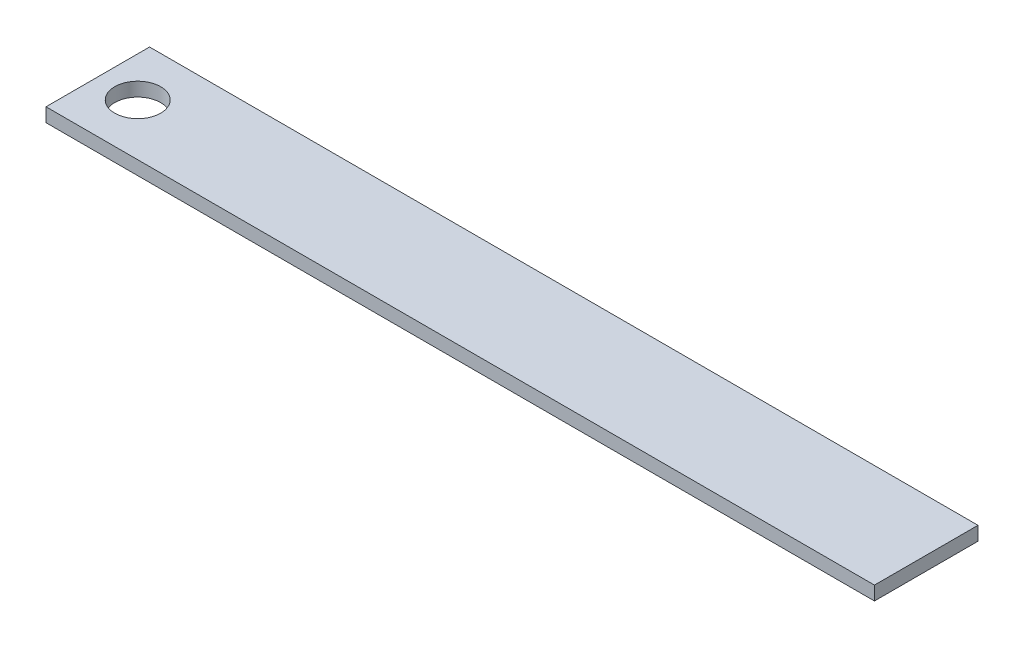
ISO-10303-21;
HEADER;
FILE_DESCRIPTION(('STEP AP214'),'2;1');
FILE_NAME('part.step','',(''),(''),'','','');
FILE_SCHEMA(('AUTOMOTIVE_DESIGN { 1 0 10303 214 1 1 1 1 }'));
ENDSEC;
DATA;
#1=APPLICATION_CONTEXT('core data for automotive mechanical design processes');
#2=APPLICATION_PROTOCOL_DEFINITION('international standard','automotive_design',2000,#1);
#3=PRODUCT_CONTEXT('',#1,'mechanical');
#4=PRODUCT('Part','Part','',(#3));
#5=PRODUCT_RELATED_PRODUCT_CATEGORY('part','',(#4));
#6=PRODUCT_DEFINITION_FORMATION('','',#4);
#7=PRODUCT_DEFINITION_CONTEXT('part definition',#1,'design');
#8=PRODUCT_DEFINITION('design','',#6,#7);
#9=PRODUCT_DEFINITION_SHAPE('','',#8);
#10=(LENGTH_UNIT() NAMED_UNIT(*) SI_UNIT(.MILLI.,.METRE.));
#11=(NAMED_UNIT(*) PLANE_ANGLE_UNIT() SI_UNIT($,.RADIAN.));
#12=(NAMED_UNIT(*) SI_UNIT($,.STERADIAN.) SOLID_ANGLE_UNIT());
#13=UNCERTAINTY_MEASURE_WITH_UNIT(LENGTH_MEASURE(1.E-05),#10,'distance_accuracy_value','');
#14=(GEOMETRIC_REPRESENTATION_CONTEXT(3) GLOBAL_UNCERTAINTY_ASSIGNED_CONTEXT((#13)) GLOBAL_UNIT_ASSIGNED_CONTEXT((#10,
#11,#12)) REPRESENTATION_CONTEXT('',''));
#15=CARTESIAN_POINT('',(0.,0.,0.));
#16=DIRECTION('',(0.,0.,1.));
#17=DIRECTION('',(1.,0.,0.));
#18=AXIS2_PLACEMENT_3D('',#15,#16,#17);
#19=CARTESIAN_POINT('',(0.,2.,0.));
#20=DIRECTION('',(0.,1.,0.));
#21=DIRECTION('',(0.,0.,1.));
#22=AXIS2_PLACEMENT_3D('',#19,#20,#21);
#23=PLANE('',#22);
#24=DIRECTION('',(0.,0.,-1.));
#25=VECTOR('',#24,1.);
#26=CARTESIAN_POINT('',(60.,2.,7.49999999999999));
#27=LINE('',#26,#25);
#28=CARTESIAN_POINT('',(60.,2.,7.49999999999999));
#29=VERTEX_POINT('',#28);
#30=CARTESIAN_POINT('',(60.,2.,-7.50000000000001));
#31=VERTEX_POINT('',#30);
#32=EDGE_CURVE('E85',#29,#31,#27,.T.);
#33=ORIENTED_EDGE('',*,*,#32,.T.);
#34=DIRECTION('',(-1.,0.,0.));
#35=VECTOR('',#34,1.);
#36=CARTESIAN_POINT('',(60.,2.,-7.50000000000001));
#37=LINE('',#36,#35);
#38=CARTESIAN_POINT('',(-60.,2.,-7.49999999999999));
#39=VERTEX_POINT('',#38);
#40=EDGE_CURVE('E80',#31,#39,#37,.T.);
#41=ORIENTED_EDGE('',*,*,#40,.T.);
#42=DIRECTION('',(0.,0.,1.));
#43=VECTOR('',#42,1.);
#44=CARTESIAN_POINT('',(-60.,2.,7.50000000000001));
#45=LINE('',#44,#43);
#46=CARTESIAN_POINT('',(-60.,2.,7.50000000000001));
#47=VERTEX_POINT('',#46);
#48=EDGE_CURVE('E83',#39,#47,#45,.T.);
#49=ORIENTED_EDGE('',*,*,#48,.T.);
#50=DIRECTION('',(1.,0.,0.));
#51=VECTOR('',#50,1.);
#52=CARTESIAN_POINT('',(60.,2.,7.49999999999999));
#53=LINE('',#52,#51);
#54=EDGE_CURVE('E50',#47,#29,#53,.T.);
#55=ORIENTED_EDGE('',*,*,#54,.T.);
#56=EDGE_LOOP('',(#33,#41,#49,#55));
#57=FACE_BOUND('',#56,.T.);
#58=CARTESIAN_POINT('',(-54.2174768420125,2.,0.));
#59=DIRECTION('',(0.,1.,0.));
#60=DIRECTION('',(0.,0.,1.));
#61=AXIS2_PLACEMENT_3D('',#58,#59,#60);
#62=CIRCLE('',#61,3.32755818657465);
#63=CARTESIAN_POINT('',(-54.2174768420125,2.,3.32755818657465));
#64=VERTEX_POINT('',#63);
#65=EDGE_CURVE('E100',#64,#64,#62,.T.);
#66=ORIENTED_EDGE('',*,*,#65,.F.);
#67=EDGE_LOOP('',(#66));
#68=FACE_BOUND('',#67,.T.);
#69=ADVANCED_FACE('F33',(#57,#68),#23,.T.);
#70=CARTESIAN_POINT('',(0.,0.,0.));
#71=DIRECTION('',(0.,1.,0.));
#72=DIRECTION('',(0.,0.,1.));
#73=AXIS2_PLACEMENT_3D('',#70,#71,#72);
#74=PLANE('',#73);
#75=DIRECTION('',(0.,0.,-1.));
#76=VECTOR('',#75,1.);
#77=CARTESIAN_POINT('',(60.,0.,7.49999999999999));
#78=LINE('',#77,#76);
#79=CARTESIAN_POINT('',(60.,0.,7.49999999999999));
#80=VERTEX_POINT('',#79);
#81=CARTESIAN_POINT('',(60.,0.,-7.50000000000001));
#82=VERTEX_POINT('',#81);
#83=EDGE_CURVE('E97',#80,#82,#78,.T.);
#84=ORIENTED_EDGE('',*,*,#83,.F.);
#85=DIRECTION('',(1.,0.,0.));
#86=VECTOR('',#85,1.);
#87=CARTESIAN_POINT('',(60.,0.,7.49999999999999));
#88=LINE('',#87,#86);
#89=CARTESIAN_POINT('',(-60.,0.,7.50000000000001));
#90=VERTEX_POINT('',#89);
#91=EDGE_CURVE('E73',#90,#80,#88,.T.);
#92=ORIENTED_EDGE('',*,*,#91,.F.);
#93=DIRECTION('',(0.,0.,1.));
#94=VECTOR('',#93,1.);
#95=CARTESIAN_POINT('',(-60.,0.,7.50000000000001));
#96=LINE('',#95,#94);
#97=CARTESIAN_POINT('',(-60.,0.,-7.49999999999999));
#98=VERTEX_POINT('',#97);
#99=EDGE_CURVE('E67',#98,#90,#96,.T.);
#100=ORIENTED_EDGE('',*,*,#99,.F.);
#101=DIRECTION('',(-1.,0.,0.));
#102=VECTOR('',#101,1.);
#103=CARTESIAN_POINT('',(60.,0.,-7.50000000000001));
#104=LINE('',#103,#102);
#105=EDGE_CURVE('E89',#82,#98,#104,.T.);
#106=ORIENTED_EDGE('',*,*,#105,.F.);
#107=EDGE_LOOP('',(#84,#92,#100,#106));
#108=FACE_BOUND('',#107,.T.);
#109=CARTESIAN_POINT('',(-54.2174768420125,0.,0.));
#110=DIRECTION('',(0.,1.,0.));
#111=DIRECTION('',(0.,0.,1.));
#112=AXIS2_PLACEMENT_3D('',#109,#110,#111);
#113=CIRCLE('',#112,3.32755818657465);
#114=CARTESIAN_POINT('',(-54.2174768420125,0.,3.32755818657465));
#115=VERTEX_POINT('',#114);
#116=EDGE_CURVE('E112',#115,#115,#113,.T.);
#117=ORIENTED_EDGE('',*,*,#116,.T.);
#118=EDGE_LOOP('',(#117));
#119=FACE_BOUND('',#118,.T.);
#120=ADVANCED_FACE('F108',(#108,#119),#74,.F.);
#121=CARTESIAN_POINT('',(60.,2.,7.49999999999999));
#122=DIRECTION('',(-1.,0.,0.));
#123=DIRECTION('',(0.,0.,1.));
#124=AXIS2_PLACEMENT_3D('',#121,#122,#123);
#125=PLANE('',#124);
#126=ORIENTED_EDGE('',*,*,#83,.T.);
#127=DIRECTION('',(0.,-1.,0.));
#128=VECTOR('',#127,1.);
#129=CARTESIAN_POINT('',(60.,2.,-7.50000000000001));
#130=LINE('',#129,#128);
#131=EDGE_CURVE('E11',#31,#82,#130,.T.);
#132=ORIENTED_EDGE('',*,*,#131,.F.);
#133=ORIENTED_EDGE('',*,*,#32,.F.);
#134=DIRECTION('',(0.,-1.,0.));
#135=VECTOR('',#134,1.);
#136=CARTESIAN_POINT('',(60.,2.,7.49999999999999));
#137=LINE('',#136,#135);
#138=EDGE_CURVE('E93',#29,#80,#137,.T.);
#139=ORIENTED_EDGE('',*,*,#138,.T.);
#140=EDGE_LOOP('',(#126,#132,#133,#139));
#141=FACE_BOUND('',#140,.T.);
#142=ADVANCED_FACE('F35',(#141),#125,.F.);
#143=CARTESIAN_POINT('',(60.,2.,-7.50000000000001));
#144=DIRECTION('',(0.,0.,1.));
#145=DIRECTION('',(1.,0.,0.));
#146=AXIS2_PLACEMENT_3D('',#143,#144,#145);
#147=PLANE('',#146);
#148=ORIENTED_EDGE('',*,*,#105,.T.);
#149=DIRECTION('',(0.,-1.,0.));
#150=VECTOR('',#149,1.);
#151=CARTESIAN_POINT('',(-60.,2.,-7.49999999999999));
#152=LINE('',#151,#150);
#153=EDGE_CURVE('E42',#39,#98,#152,.T.);
#154=ORIENTED_EDGE('',*,*,#153,.F.);
#155=ORIENTED_EDGE('',*,*,#40,.F.);
#156=ORIENTED_EDGE('',*,*,#131,.T.);
#157=EDGE_LOOP('',(#148,#154,#155,#156));
#158=FACE_BOUND('',#157,.T.);
#159=ADVANCED_FACE('F88',(#158),#147,.F.);
#160=CARTESIAN_POINT('',(-60.,2.,7.50000000000001));
#161=DIRECTION('',(1.,0.,0.));
#162=DIRECTION('',(0.,0.,-1.));
#163=AXIS2_PLACEMENT_3D('',#160,#161,#162);
#164=PLANE('',#163);
#165=ORIENTED_EDGE('',*,*,#99,.T.);
#166=DIRECTION('',(0.,-1.,0.));
#167=VECTOR('',#166,1.);
#168=CARTESIAN_POINT('',(-60.,2.,7.50000000000001));
#169=LINE('',#168,#167);
#170=EDGE_CURVE('E90',#47,#90,#169,.T.);
#171=ORIENTED_EDGE('',*,*,#170,.F.);
#172=ORIENTED_EDGE('',*,*,#48,.F.);
#173=ORIENTED_EDGE('',*,*,#153,.T.);
#174=EDGE_LOOP('',(#165,#171,#172,#173));
#175=FACE_BOUND('',#174,.T.);
#176=ADVANCED_FACE('F91',(#175),#164,.F.);
#177=CARTESIAN_POINT('',(60.,2.,7.49999999999999));
#178=DIRECTION('',(0.,0.,-1.));
#179=DIRECTION('',(-1.,0.,0.));
#180=AXIS2_PLACEMENT_3D('',#177,#178,#179);
#181=PLANE('',#180);
#182=ORIENTED_EDGE('',*,*,#91,.T.);
#183=ORIENTED_EDGE('',*,*,#138,.F.);
#184=ORIENTED_EDGE('',*,*,#54,.F.);
#185=ORIENTED_EDGE('',*,*,#170,.T.);
#186=EDGE_LOOP('',(#182,#183,#184,#185));
#187=FACE_BOUND('',#186,.T.);
#188=ADVANCED_FACE('F105',(#187),#181,.F.);
#189=CARTESIAN_POINT('',(-54.2174768420125,2.,0.));
#190=DIRECTION('',(0.,-1.,0.));
#191=DIRECTION('',(0.,0.,-1.));
#192=AXIS2_PLACEMENT_3D('',#189,#190,#191);
#193=CYLINDRICAL_SURFACE('',#192,3.32755818657465);
#194=ORIENTED_EDGE('',*,*,#65,.T.);
#195=EDGE_LOOP('',(#194));
#196=FACE_BOUND('',#195,.T.);
#197=ORIENTED_EDGE('',*,*,#116,.F.);
#198=EDGE_LOOP('',(#197));
#199=FACE_BOUND('',#198,.T.);
#200=ADVANCED_FACE('F118',(#196,#199),#193,.F.);
#201=CLOSED_SHELL('',(#69,#120,#142,#159,#176,#188,#200));
#202=MANIFOLD_SOLID_BREP('B2',#201);
#203=ADVANCED_BREP_SHAPE_REPRESENTATION('',(#18,#202),#14);
#204=SHAPE_DEFINITION_REPRESENTATION(#9,#203);
ENDSEC;
END-ISO-10303-21;
